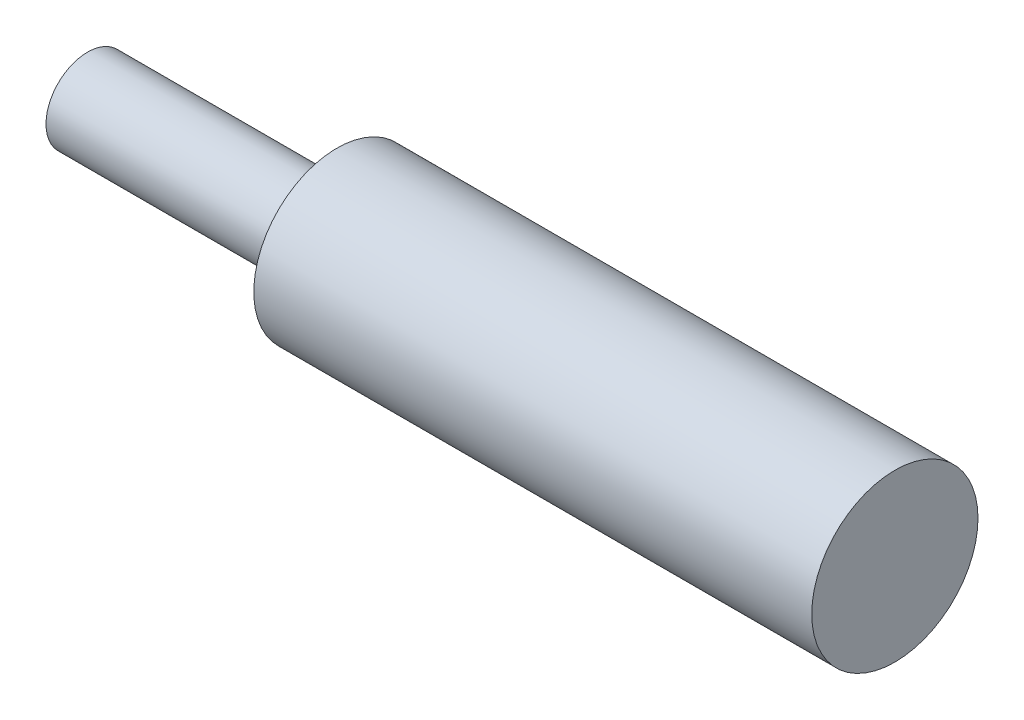
ISO-10303-21;
HEADER;
FILE_DESCRIPTION(('STEP AP214'),'2;1');
FILE_NAME('part.step','',(''),(''),'','','');
FILE_SCHEMA(('AUTOMOTIVE_DESIGN { 1 0 10303 214 1 1 1 1 }'));
ENDSEC;
DATA;
#1=APPLICATION_CONTEXT('core data for automotive mechanical design processes');
#2=APPLICATION_PROTOCOL_DEFINITION('international standard','automotive_design',2000,#1);
#3=PRODUCT_CONTEXT('',#1,'mechanical');
#4=PRODUCT('Part','Part','',(#3));
#5=PRODUCT_RELATED_PRODUCT_CATEGORY('part','',(#4));
#6=PRODUCT_DEFINITION_FORMATION('','',#4);
#7=PRODUCT_DEFINITION_CONTEXT('part definition',#1,'design');
#8=PRODUCT_DEFINITION('design','',#6,#7);
#9=PRODUCT_DEFINITION_SHAPE('','',#8);
#10=(LENGTH_UNIT() NAMED_UNIT(*) SI_UNIT(.MILLI.,.METRE.));
#11=(NAMED_UNIT(*) PLANE_ANGLE_UNIT() SI_UNIT($,.RADIAN.));
#12=(NAMED_UNIT(*) SI_UNIT($,.STERADIAN.) SOLID_ANGLE_UNIT());
#13=UNCERTAINTY_MEASURE_WITH_UNIT(LENGTH_MEASURE(1.E-05),#10,'distance_accuracy_value','');
#14=(GEOMETRIC_REPRESENTATION_CONTEXT(3) GLOBAL_UNCERTAINTY_ASSIGNED_CONTEXT((#13)) GLOBAL_UNIT_ASSIGNED_CONTEXT((#10,
#11,#12)) REPRESENTATION_CONTEXT('',''));
#15=CARTESIAN_POINT('',(0.,0.,0.));
#16=DIRECTION('',(0.,0.,1.));
#17=DIRECTION('',(1.,0.,0.));
#18=AXIS2_PLACEMENT_3D('',#15,#16,#17);
#19=CARTESIAN_POINT('',(2842.80735993775,11.5,23.734));
#20=DIRECTION('',(-1.,0.,0.));
#21=DIRECTION('',(0.,0.,1.));
#22=AXIS2_PLACEMENT_3D('',#19,#20,#21);
#23=CYLINDRICAL_SURFACE('',#22,4.);
#24=CARTESIAN_POINT('',(2753.79365143877,11.5,23.734));
#25=DIRECTION('',(-1.,0.,0.));
#26=DIRECTION('',(0.,0.,1.));
#27=AXIS2_PLACEMENT_3D('',#24,#25,#26);
#28=CIRCLE('',#27,4.);
#29=CARTESIAN_POINT('',(2753.79365143877,11.5,27.734));
#30=VERTEX_POINT('',#29);
#31=EDGE_CURVE('E10',#30,#30,#28,.T.);
#32=CARTESIAN_POINT('',(2777.79365143877,11.5,23.734));
#33=DIRECTION('',(1.,0.,0.));
#34=DIRECTION('',(0.,0.,-1.));
#35=AXIS2_PLACEMENT_3D('',#32,#33,#34);
#36=CIRCLE('',#35,4.);
#37=CARTESIAN_POINT('',(2777.79365143877,11.5,27.734));
#38=VERTEX_POINT('',#37);
#39=EDGE_CURVE('E32',#38,#38,#36,.F.);
#40=CARTESIAN_POINT('',(2753.79365143877,11.5,27.734));
#41=CARTESIAN_POINT('',(2754.04365143877,11.5,27.734));
#42=CARTESIAN_POINT('',(2754.29365143877,11.5,27.734));
#43=CARTESIAN_POINT('',(2754.79365143877,11.5,27.734));
#44=CARTESIAN_POINT('',(2755.04365143877,11.5,27.734));
#45=CARTESIAN_POINT('',(2755.54365143877,11.5,27.734));
#46=CARTESIAN_POINT('',(2755.79365143877,11.5,27.734));
#47=CARTESIAN_POINT('',(2756.29365143877,11.5,27.734));
#48=CARTESIAN_POINT('',(2756.54365143877,11.5,27.734));
#49=CARTESIAN_POINT('',(2757.04365143877,11.5,27.734));
#50=CARTESIAN_POINT('',(2757.29365143877,11.5,27.734));
#51=CARTESIAN_POINT('',(2757.79365143877,11.5,27.734));
#52=CARTESIAN_POINT('',(2758.04365143877,11.5,27.734));
#53=CARTESIAN_POINT('',(2758.54365143877,11.5,27.734));
#54=CARTESIAN_POINT('',(2758.79365143877,11.5,27.734));
#55=CARTESIAN_POINT('',(2759.29365143877,11.5,27.734));
#56=CARTESIAN_POINT('',(2759.54365143877,11.5,27.734));
#57=CARTESIAN_POINT('',(2760.04365143877,11.5,27.734));
#58=CARTESIAN_POINT('',(2760.29365143877,11.5,27.734));
#59=CARTESIAN_POINT('',(2760.79365143877,11.5,27.734));
#60=CARTESIAN_POINT('',(2761.04365143877,11.5,27.734));
#61=CARTESIAN_POINT('',(2761.54365143877,11.5,27.734));
#62=CARTESIAN_POINT('',(2761.79365143877,11.5,27.734));
#63=CARTESIAN_POINT('',(2762.29365143877,11.5,27.734));
#64=CARTESIAN_POINT('',(2762.54365143877,11.5,27.734));
#65=CARTESIAN_POINT('',(2763.04365143877,11.5,27.734));
#66=CARTESIAN_POINT('',(2763.29365143877,11.5,27.734));
#67=CARTESIAN_POINT('',(2763.79365143877,11.5,27.734));
#68=CARTESIAN_POINT('',(2764.04365143877,11.5,27.734));
#69=CARTESIAN_POINT('',(2764.54365143877,11.5,27.734));
#70=CARTESIAN_POINT('',(2764.79365143877,11.5,27.734));
#71=CARTESIAN_POINT('',(2765.29365143877,11.5,27.734));
#72=CARTESIAN_POINT('',(2765.54365143877,11.5,27.734));
#73=CARTESIAN_POINT('',(2766.04365143877,11.5,27.734));
#74=CARTESIAN_POINT('',(2766.29365143877,11.5,27.734));
#75=CARTESIAN_POINT('',(2766.79365143877,11.5,27.734));
#76=CARTESIAN_POINT('',(2767.04365143877,11.5,27.734));
#77=CARTESIAN_POINT('',(2767.54365143877,11.5,27.734));
#78=CARTESIAN_POINT('',(2767.79365143877,11.5,27.734));
#79=CARTESIAN_POINT('',(2768.29365143877,11.5,27.734));
#80=CARTESIAN_POINT('',(2768.54365143877,11.5,27.734));
#81=CARTESIAN_POINT('',(2769.04365143877,11.5,27.734));
#82=CARTESIAN_POINT('',(2769.29365143877,11.5,27.734));
#83=CARTESIAN_POINT('',(2769.79365143877,11.5,27.734));
#84=CARTESIAN_POINT('',(2770.04365143877,11.5,27.734));
#85=CARTESIAN_POINT('',(2770.54365143877,11.5,27.734));
#86=CARTESIAN_POINT('',(2770.79365143877,11.5,27.734));
#87=CARTESIAN_POINT('',(2771.29365143877,11.5,27.734));
#88=CARTESIAN_POINT('',(2771.54365143877,11.5,27.734));
#89=CARTESIAN_POINT('',(2772.04365143877,11.5,27.734));
#90=CARTESIAN_POINT('',(2772.29365143877,11.5,27.734));
#91=CARTESIAN_POINT('',(2772.79365143877,11.5,27.734));
#92=CARTESIAN_POINT('',(2773.04365143877,11.5,27.734));
#93=CARTESIAN_POINT('',(2773.54365143877,11.5,27.734));
#94=CARTESIAN_POINT('',(2773.79365143877,11.5,27.734));
#95=CARTESIAN_POINT('',(2774.29365143877,11.5,27.734));
#96=CARTESIAN_POINT('',(2774.54365143877,11.5,27.734));
#97=CARTESIAN_POINT('',(2775.04365143877,11.5,27.734));
#98=CARTESIAN_POINT('',(2775.29365143877,11.5,27.734));
#99=CARTESIAN_POINT('',(2775.79365143877,11.5,27.734));
#100=CARTESIAN_POINT('',(2776.04365143877,11.5,27.734));
#101=CARTESIAN_POINT('',(2776.54365143877,11.5,27.734));
#102=CARTESIAN_POINT('',(2776.79365143877,11.5,27.734));
#103=CARTESIAN_POINT('',(2777.29365143877,11.5,27.734));
#104=CARTESIAN_POINT('',(2777.54365143877,11.5,27.734));
#105=CARTESIAN_POINT('',(2777.79365143877,11.5,27.734));
#106=B_SPLINE_CURVE_WITH_KNOTS('',3,(#40,#41,#42,#43,#44,#45,#46,#47,#48,#49,#50,#51,#52,#53,
#54,#55,#56,#57,#58,#59,#60,#61,#62,#63,#64,#65,#66,#67,#68,#69,#70,#71,#72,#73,#74,#75,#76,#77,
#78,#79,#80,#81,#82,#83,#84,#85,#86,#87,#88,#89,#90,#91,#92,#93,#94,#95,#96,#97,#98,#99,#100,
#101,#102,#103,#104,#105),.UNSPECIFIED.,.F.,.F.,(4,2,2,2,2,2,2,2,2,2,2,2,2,2,2,2,2,2,2,2,2,2,2,
2,2,2,2,2,2,2,2,2,4),(0.,0.750000000000028,1.50000000000006,2.25000000000009,3.00000000000011,
3.75000000000014,4.50000000000017,5.2500000000002,6.00000000000023,6.75000000000026,
7.50000000000028,8.24999999999987,8.9999999999999,9.74999999999993,10.5,11.25,12.,12.75,
13.5000000000001,14.2500000000001,15.0000000000001,15.7500000000002,16.4999999999997,
17.2499999999998,17.9999999999998,18.7499999999998,19.4999999999999,20.2499999999999,
20.9999999999999,21.7499999999999,22.5,23.25,24.),.UNSPECIFIED.);
#107=EDGE_CURVE('BSEAM29',#30,#38,#106,.T.);
#108=ORIENTED_EDGE('',*,*,#31,.F.);
#109=ORIENTED_EDGE('',*,*,#39,.T.);
#110=ORIENTED_EDGE('',*,*,#107,.T.);
#111=ORIENTED_EDGE('',*,*,#107,.F.);
#112=EDGE_LOOP('',(#108,#110,#109,#111));
#113=FACE_BOUND('',#112,.T.);
#114=ADVANCED_FACE('F29',(#113),#23,.T.);
#115=CARTESIAN_POINT('',(2753.79365143877,11.5,23.734));
#116=DIRECTION('',(-1.,0.,0.));
#117=DIRECTION('',(0.,0.,1.));
#118=AXIS2_PLACEMENT_3D('',#115,#116,#117);
#119=PLANE('',#118);
#120=ORIENTED_EDGE('',*,*,#31,.T.);
#121=EDGE_LOOP('',(#120));
#122=FACE_BOUND('',#121,.T.);
#123=ADVANCED_FACE('F60',(#122),#119,.T.);
#124=CARTESIAN_POINT('',(2755.1662344408,11.5,23.734));
#125=DIRECTION('',(1.,0.,0.));
#126=DIRECTION('',(0.,0.,-1.));
#127=AXIS2_PLACEMENT_3D('',#124,#125,#126);
#128=CYLINDRICAL_SURFACE('',#127,7.99999999999999);
#129=CARTESIAN_POINT('',(2777.79365143877,11.5,23.734));
#130=DIRECTION('',(1.,0.,0.));
#131=DIRECTION('',(0.,0.,-1.));
#132=AXIS2_PLACEMENT_3D('',#129,#130,#131);
#133=CIRCLE('',#132,7.99999999999999);
#134=CARTESIAN_POINT('',(2777.79365143877,11.5,15.734));
#135=VERTEX_POINT('',#134);
#136=EDGE_CURVE('E39',#135,#135,#133,.T.);
#137=ORIENTED_EDGE('',*,*,#136,.T.);
#138=EDGE_LOOP('',(#137));
#139=FACE_BOUND('',#138,.T.);
#140=CARTESIAN_POINT('',(2831.49365143877,11.5,23.734));
#141=DIRECTION('',(-1.,0.,0.));
#142=DIRECTION('',(0.,0.,1.));
#143=AXIS2_PLACEMENT_3D('',#140,#141,#142);
#144=CIRCLE('',#143,7.99999999999999);
#145=CARTESIAN_POINT('',(2831.49365143877,11.5,31.734));
#146=VERTEX_POINT('',#145);
#147=EDGE_CURVE('E43',#146,#146,#144,.T.);
#148=ORIENTED_EDGE('',*,*,#147,.T.);
#149=EDGE_LOOP('',(#148));
#150=FACE_BOUND('',#149,.T.);
#151=ADVANCED_FACE('F47',(#139,#150),#128,.T.);
#152=CARTESIAN_POINT('',(2777.79365143877,11.5,8.87500000000001));
#153=DIRECTION('',(1.,0.,0.));
#154=DIRECTION('',(0.,0.,-1.));
#155=AXIS2_PLACEMENT_3D('',#152,#153,#154);
#156=PLANE('',#155);
#157=ORIENTED_EDGE('',*,*,#39,.F.);
#158=EDGE_LOOP('',(#157));
#159=FACE_BOUND('',#158,.T.);
#160=ORIENTED_EDGE('',*,*,#136,.F.);
#161=EDGE_LOOP('',(#160));
#162=FACE_BOUND('',#161,.T.);
#163=ADVANCED_FACE('F51',(#159,#162),#156,.F.);
#164=CARTESIAN_POINT('',(2831.49365143877,11.5,8.87500000000001));
#165=DIRECTION('',(-1.,0.,0.));
#166=DIRECTION('',(0.,0.,1.));
#167=AXIS2_PLACEMENT_3D('',#164,#165,#166);
#168=PLANE('',#167);
#169=ORIENTED_EDGE('',*,*,#147,.F.);
#170=EDGE_LOOP('',(#169));
#171=FACE_BOUND('',#170,.T.);
#172=ADVANCED_FACE('F49',(#171),#168,.F.);
#173=CLOSED_SHELL('',(#114,#123,#151,#163,#172));
#174=MANIFOLD_SOLID_BREP('B2',#173);
#175=ADVANCED_BREP_SHAPE_REPRESENTATION('',(#18,#174),#14);
#176=SHAPE_DEFINITION_REPRESENTATION(#9,#175);
ENDSEC;
END-ISO-10303-21;
